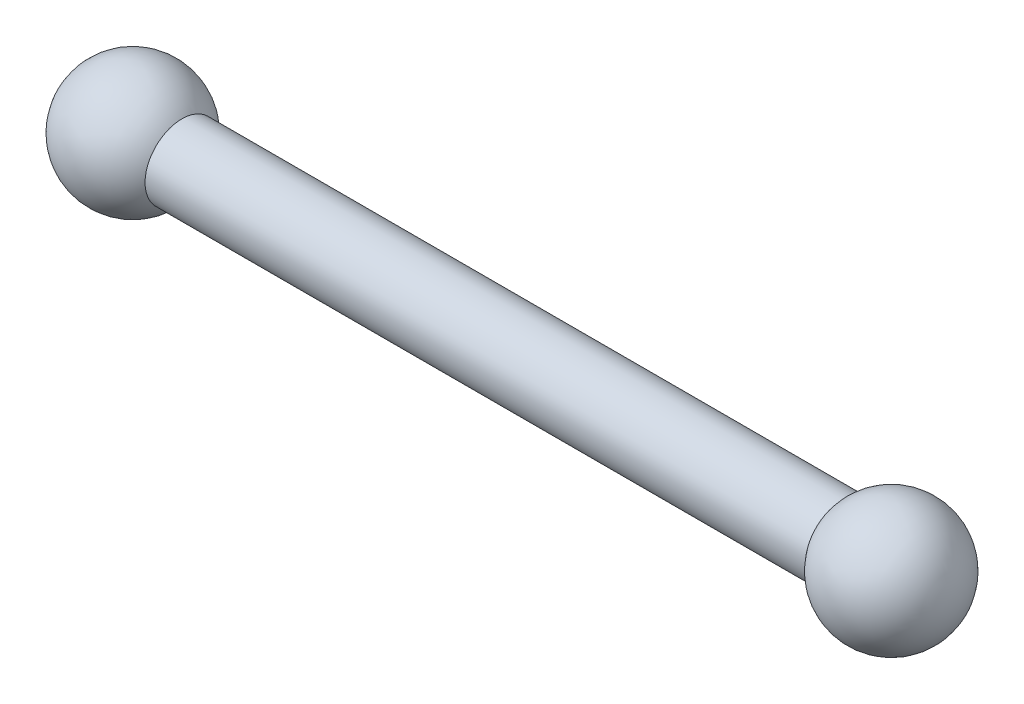
ISO-10303-21;
HEADER;
FILE_DESCRIPTION(('STEP AP214'),'2;1');
FILE_NAME('part.step','',(''),(''),'','','');
FILE_SCHEMA(('AUTOMOTIVE_DESIGN { 1 0 10303 214 1 1 1 1 }'));
ENDSEC;
DATA;
#1=APPLICATION_CONTEXT('core data for automotive mechanical design processes');
#2=APPLICATION_PROTOCOL_DEFINITION('international standard','automotive_design',2000,#1);
#3=PRODUCT_CONTEXT('',#1,'mechanical');
#4=PRODUCT('Part','Part','',(#3));
#5=PRODUCT_RELATED_PRODUCT_CATEGORY('part','',(#4));
#6=PRODUCT_DEFINITION_FORMATION('','',#4);
#7=PRODUCT_DEFINITION_CONTEXT('part definition',#1,'design');
#8=PRODUCT_DEFINITION('design','',#6,#7);
#9=PRODUCT_DEFINITION_SHAPE('','',#8);
#10=(LENGTH_UNIT() NAMED_UNIT(*) SI_UNIT(.MILLI.,.METRE.));
#11=(NAMED_UNIT(*) PLANE_ANGLE_UNIT() SI_UNIT($,.RADIAN.));
#12=(NAMED_UNIT(*) SI_UNIT($,.STERADIAN.) SOLID_ANGLE_UNIT());
#13=UNCERTAINTY_MEASURE_WITH_UNIT(LENGTH_MEASURE(1.E-05),#10,'distance_accuracy_value','');
#14=(GEOMETRIC_REPRESENTATION_CONTEXT(3) GLOBAL_UNCERTAINTY_ASSIGNED_CONTEXT((#13)) GLOBAL_UNIT_ASSIGNED_CONTEXT((#10,
#11,#12)) REPRESENTATION_CONTEXT('',''));
#15=CARTESIAN_POINT('',(0.,0.,0.));
#16=DIRECTION('',(0.,0.,1.));
#17=DIRECTION('',(1.,0.,0.));
#18=AXIS2_PLACEMENT_3D('',#15,#16,#17);
#19=CARTESIAN_POINT('',(30.9,0.,-2.5));
#20=DIRECTION('',(-1.,0.,0.));
#21=DIRECTION('',(0.,0.,1.));
#22=AXIS2_PLACEMENT_3D('',#19,#20,#21);
#23=CYLINDRICAL_SURFACE('',#22,1.5);
#24=CARTESIAN_POINT('',(2.00000000000001,0.,-2.5));
#25=DIRECTION('',(-1.,0.,0.));
#26=DIRECTION('',(0.,0.,1.));
#27=AXIS2_PLACEMENT_3D('',#24,#25,#26);
#28=CIRCLE('',#27,1.5);
#29=CARTESIAN_POINT('',(2.00000000000001,0.,-1.));
#30=VERTEX_POINT('',#29);
#31=EDGE_CURVE('E47',#30,#30,#28,.T.);
#32=CARTESIAN_POINT('',(28.9,0.,-2.5));
#33=DIRECTION('',(0.999999999999999,0.,0.));
#34=DIRECTION('',(0.,0.,-1.));
#35=AXIS2_PLACEMENT_3D('',#32,#33,#34);
#36=CIRCLE('',#35,1.5);
#37=CARTESIAN_POINT('',(28.9,0.,-1.));
#38=VERTEX_POINT('',#37);
#39=EDGE_CURVE('E10',#38,#38,#36,.F.);
#40=CARTESIAN_POINT('',(2.00000000000001,0.,-1.));
#41=CARTESIAN_POINT('',(2.28020833333334,0.,-1.));
#42=CARTESIAN_POINT('',(2.56041666666668,0.,-1.));
#43=CARTESIAN_POINT('',(3.12083333333334,0.,-1.));
#44=CARTESIAN_POINT('',(3.40104166666667,0.,-1.));
#45=CARTESIAN_POINT('',(3.96145833333334,0.,-1.));
#46=CARTESIAN_POINT('',(4.24166666666668,0.,-1.));
#47=CARTESIAN_POINT('',(4.80208333333334,0.,-1.));
#48=CARTESIAN_POINT('',(5.08229166666667,0.,-1.));
#49=CARTESIAN_POINT('',(5.64270833333334,0.,-1.));
#50=CARTESIAN_POINT('',(5.92291666666667,0.,-1.));
#51=CARTESIAN_POINT('',(6.48333333333334,0.,-1.));
#52=CARTESIAN_POINT('',(6.76354166666667,0.,-1.));
#53=CARTESIAN_POINT('',(7.32395833333334,0.,-1.));
#54=CARTESIAN_POINT('',(7.60416666666667,0.,-1.));
#55=CARTESIAN_POINT('',(8.16458333333334,0.,-1.));
#56=CARTESIAN_POINT('',(8.44479166666667,0.,-1.));
#57=CARTESIAN_POINT('',(9.00520833333334,0.,-1.));
#58=CARTESIAN_POINT('',(9.28541666666668,0.,-1.));
#59=CARTESIAN_POINT('',(9.84583333333334,0.,-1.));
#60=CARTESIAN_POINT('',(10.1260416666667,0.,-1.));
#61=CARTESIAN_POINT('',(10.6864583333333,0.,-1.));
#62=CARTESIAN_POINT('',(10.9666666666667,0.,-1.));
#63=CARTESIAN_POINT('',(11.5270833333333,0.,-1.));
#64=CARTESIAN_POINT('',(11.8072916666667,0.,-1.));
#65=CARTESIAN_POINT('',(12.3677083333333,0.,-1.));
#66=CARTESIAN_POINT('',(12.6479166666667,0.,-1.));
#67=CARTESIAN_POINT('',(13.2083333333333,0.,-1.));
#68=CARTESIAN_POINT('',(13.4885416666667,0.,-1.));
#69=CARTESIAN_POINT('',(14.0489583333333,0.,-1.));
#70=CARTESIAN_POINT('',(14.3291666666667,0.,-1.));
#71=CARTESIAN_POINT('',(14.8895833333333,0.,-1.));
#72=CARTESIAN_POINT('',(15.1697916666667,0.,-1.));
#73=CARTESIAN_POINT('',(15.7302083333333,0.,-1.));
#74=CARTESIAN_POINT('',(16.0104166666667,0.,-1.));
#75=CARTESIAN_POINT('',(16.5708333333333,0.,-1.));
#76=CARTESIAN_POINT('',(16.8510416666667,0.,-1.));
#77=CARTESIAN_POINT('',(17.4114583333333,0.,-1.));
#78=CARTESIAN_POINT('',(17.6916666666667,0.,-1.));
#79=CARTESIAN_POINT('',(18.2520833333333,0.,-1.));
#80=CARTESIAN_POINT('',(18.5322916666667,0.,-1.));
#81=CARTESIAN_POINT('',(19.0927083333333,0.,-1.));
#82=CARTESIAN_POINT('',(19.3729166666667,0.,-1.));
#83=CARTESIAN_POINT('',(19.9333333333333,0.,-1.));
#84=CARTESIAN_POINT('',(20.2135416666667,0.,-1.));
#85=CARTESIAN_POINT('',(20.7739583333333,0.,-1.));
#86=CARTESIAN_POINT('',(21.0541666666667,0.,-1.));
#87=CARTESIAN_POINT('',(21.6145833333333,0.,-1.));
#88=CARTESIAN_POINT('',(21.8947916666667,0.,-1.));
#89=CARTESIAN_POINT('',(22.4552083333333,0.,-1.));
#90=CARTESIAN_POINT('',(22.7354166666667,0.,-1.));
#91=CARTESIAN_POINT('',(23.2958333333333,0.,-1.));
#92=CARTESIAN_POINT('',(23.5760416666667,0.,-1.));
#93=CARTESIAN_POINT('',(24.1364583333333,0.,-1.));
#94=CARTESIAN_POINT('',(24.4166666666667,0.,-1.));
#95=CARTESIAN_POINT('',(24.9770833333333,0.,-1.));
#96=CARTESIAN_POINT('',(25.2572916666667,0.,-1.));
#97=CARTESIAN_POINT('',(25.8177083333333,0.,-1.));
#98=CARTESIAN_POINT('',(26.0979166666667,0.,-1.));
#99=CARTESIAN_POINT('',(26.6583333333333,0.,-1.));
#100=CARTESIAN_POINT('',(26.9385416666667,0.,-1.));
#101=CARTESIAN_POINT('',(27.4989583333333,0.,-1.));
#102=CARTESIAN_POINT('',(27.7791666666667,0.,-1.));
#103=CARTESIAN_POINT('',(28.3395833333333,0.,-1.));
#104=CARTESIAN_POINT('',(28.6197916666667,0.,-1.));
#105=CARTESIAN_POINT('',(28.9,0.,-1.));
#106=B_SPLINE_CURVE_WITH_KNOTS('',3,(#40,#41,#42,#43,#44,#45,#46,#47,#48,#49,#50,#51,#52,#53,
#54,#55,#56,#57,#58,#59,#60,#61,#62,#63,#64,#65,#66,#67,#68,#69,#70,#71,#72,#73,#74,#75,#76,#77,
#78,#79,#80,#81,#82,#83,#84,#85,#86,#87,#88,#89,#90,#91,#92,#93,#94,#95,#96,#97,#98,#99,#100,
#101,#102,#103,#104,#105),.UNSPECIFIED.,.F.,.F.,(4,2,2,2,2,2,2,2,2,2,2,2,2,2,2,2,2,2,2,2,2,2,2,
2,2,2,2,2,2,2,2,2,4),(0.,0.840625000000001,1.68125,2.521875,3.3625,4.203125,5.04375,5.884375,
6.725,7.565625,8.40625,9.246875,10.0875,10.928125,11.76875,12.609375,13.45,14.290625,15.13125,
15.971875,16.8125,17.653125,18.49375,19.334375,20.175,21.015625,21.85625,22.696875,23.5375,
24.378125,25.21875,26.059375,26.9),.UNSPECIFIED.);
#107=EDGE_CURVE('BSEAM39',#30,#38,#106,.T.);
#108=ORIENTED_EDGE('',*,*,#31,.F.);
#109=ORIENTED_EDGE('',*,*,#39,.T.);
#110=ORIENTED_EDGE('',*,*,#107,.T.);
#111=ORIENTED_EDGE('',*,*,#107,.F.);
#112=EDGE_LOOP('',(#108,#110,#109,#111));
#113=FACE_BOUND('',#112,.T.);
#114=ADVANCED_FACE('F39',(#113),#23,.T.);
#115=CARTESIAN_POINT('',(0.,0.,-2.5));
#116=DIRECTION('',(0.,1.,0.));
#117=DIRECTION('',(0.,0.,1.));
#118=AXIS2_PLACEMENT_3D('',#115,#116,#117);
#119=SPHERICAL_SURFACE('',#118,2.5);
#120=CARTESIAN_POINT('',(0.,0.,-2.5));
#121=DIRECTION('',(-1.,0.,0.));
#122=DIRECTION('',(0.,0.,1.));
#123=AXIS2_PLACEMENT_3D('',#120,#121,#122);
#124=SPHERICAL_SURFACE('',#123,2.5);
#125=ORIENTED_EDGE('',*,*,#31,.T.);
#126=EDGE_LOOP('',(#125));
#127=FACE_BOUND('',#126,.T.);
#128=ADVANCED_FACE('F41',(#127),#124,.T.);
#129=CARTESIAN_POINT('',(30.9,0.,-2.5));
#130=DIRECTION('',(0.,1.,0.));
#131=DIRECTION('',(0.,0.,1.));
#132=AXIS2_PLACEMENT_3D('',#129,#130,#131);
#133=SPHERICAL_SURFACE('',#132,2.5);
#134=CARTESIAN_POINT('',(30.9,0.,-2.5));
#135=DIRECTION('',(1.,0.,0.));
#136=DIRECTION('',(0.,0.,-1.));
#137=AXIS2_PLACEMENT_3D('',#134,#135,#136);
#138=SPHERICAL_SURFACE('',#137,2.5);
#139=ORIENTED_EDGE('',*,*,#39,.F.);
#140=EDGE_LOOP('',(#139));
#141=FACE_BOUND('',#140,.T.);
#142=ADVANCED_FACE('F59',(#141),#138,.T.);
#143=CLOSED_SHELL('',(#114,#128,#142));
#144=MANIFOLD_SOLID_BREP('B2',#143);
#145=ADVANCED_BREP_SHAPE_REPRESENTATION('',(#18,#144),#14);
#146=SHAPE_DEFINITION_REPRESENTATION(#9,#145);
ENDSEC;
END-ISO-10303-21;
